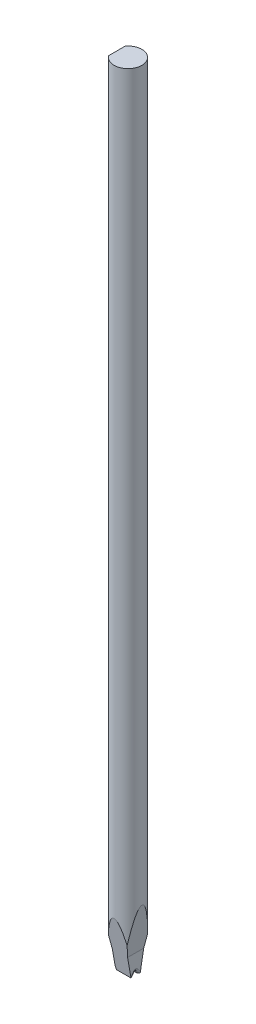
ISO-10303-21;
HEADER;
FILE_DESCRIPTION(('STEP AP214'),'2;1');
FILE_NAME('part.step','',(''),(''),'','','');
FILE_SCHEMA(('AUTOMOTIVE_DESIGN { 1 0 10303 214 1 1 1 1 }'));
ENDSEC;
DATA;
#1=APPLICATION_CONTEXT('core data for automotive mechanical design processes');
#2=APPLICATION_PROTOCOL_DEFINITION('international standard','automotive_design',2000,#1);
#3=PRODUCT_CONTEXT('',#1,'mechanical');
#4=PRODUCT('Part','Part','',(#3));
#5=PRODUCT_RELATED_PRODUCT_CATEGORY('part','',(#4));
#6=PRODUCT_DEFINITION_FORMATION('','',#4);
#7=PRODUCT_DEFINITION_CONTEXT('part definition',#1,'design');
#8=PRODUCT_DEFINITION('design','',#6,#7);
#9=PRODUCT_DEFINITION_SHAPE('','',#8);
#10=(LENGTH_UNIT() NAMED_UNIT(*) SI_UNIT(.MILLI.,.METRE.));
#11=(NAMED_UNIT(*) PLANE_ANGLE_UNIT() SI_UNIT($,.RADIAN.));
#12=(NAMED_UNIT(*) SI_UNIT($,.STERADIAN.) SOLID_ANGLE_UNIT());
#13=UNCERTAINTY_MEASURE_WITH_UNIT(LENGTH_MEASURE(1.E-05),#10,'distance_accuracy_value','');
#14=(GEOMETRIC_REPRESENTATION_CONTEXT(3) GLOBAL_UNCERTAINTY_ASSIGNED_CONTEXT((#13)) GLOBAL_UNIT_ASSIGNED_CONTEXT((#10,
#11,#12)) REPRESENTATION_CONTEXT('',''));
#15=CARTESIAN_POINT('',(0.,0.,0.));
#16=DIRECTION('',(0.,0.,1.));
#17=DIRECTION('',(1.,0.,0.));
#18=AXIS2_PLACEMENT_3D('',#15,#16,#17);
#19=CARTESIAN_POINT('',(0.,0.,0.));
#20=DIRECTION('',(0.,1.,0.));
#21=DIRECTION('',(0.,0.,1.));
#22=AXIS2_PLACEMENT_3D('',#19,#20,#21);
#23=PLANE('',#22);
#24=DIRECTION('',(-1.,0.,0.));
#25=VECTOR('',#24,1.);
#26=CARTESIAN_POINT('',(1.50859998,0.,-0.50038));
#27=LINE('',#26,#25);
#28=CARTESIAN_POINT('',(0.816955552535841,0.,-0.50038));
#29=VERTEX_POINT('',#28);
#30=CARTESIAN_POINT('',(-0.712997622489194,0.,-0.50038));
#31=VERTEX_POINT('',#30);
#32=EDGE_CURVE('E179',#29,#31,#27,.T.);
#33=ORIENTED_EDGE('',*,*,#32,.F.);
#34=CARTESIAN_POINT('',(0.57658,0.,-0.579313817389901));
#35=DIRECTION('',(0.,1.,0.));
#36=DIRECTION('',(0.,0.,-1.));
#37=AXIS2_PLACEMENT_3D('',#34,#35,#36);
#38=ELLIPSE('',#37,0.303875210634501,0.24892);
#39=CARTESIAN_POINT('',(0.57658,0.,-0.2754386067554));
#40=VERTEX_POINT('',#39);
#41=EDGE_CURVE('E276',#29,#40,#38,.F.);
#42=ORIENTED_EDGE('',*,*,#41,.T.);
#43=CARTESIAN_POINT('',(0.57658,0.,-0.2754386067554));
#44=DIRECTION('',(-1.,0.,0.));
#45=VECTOR('',#44,1.);
#46=LINE('',#43,#45);
#47=CARTESIAN_POINT('',(-0.32512,0.,-0.2754386067554));
#48=VERTEX_POINT('',#47);
#49=EDGE_CURVE('E320',#40,#48,#46,.T.);
#50=ORIENTED_EDGE('',*,*,#49,.T.);
#51=CARTESIAN_POINT('',(-0.32512,0.,-0.886289795479857));
#52=DIRECTION('',(0.,1.,0.));
#53=DIRECTION('',(0.,0.,1.));
#54=AXIS2_PLACEMENT_3D('',#51,#52,#53);
#55=ELLIPSE('',#54,0.610851188724456,0.50038);
#56=EDGE_CURVE('E279',#48,#31,#55,.F.);
#57=ORIENTED_EDGE('',*,*,#56,.T.);
#58=EDGE_LOOP('',(#33,#42,#50,#57));
#59=FACE_BOUND('',#58,.T.);
#60=ADVANCED_FACE('F41',(#59),#23,.F.);
#61=CARTESIAN_POINT('',(0.,85.4964,0.));
#62=DIRECTION('',(0.,-1.,0.));
#63=DIRECTION('',(0.,0.,-1.));
#64=AXIS2_PLACEMENT_3D('',#61,#62,#63);
#65=CYLINDRICAL_SURFACE('',#64,1.4986);
#66=CARTESIAN_POINT('',(0.,-3.76553770582815,0.));
#67=DIRECTION('',(-0.99026806874157,-0.139173100960066,0.));
#68=DIRECTION('',(0.139173100960066,-0.99026806874157,0.));
#69=AXIS2_PLACEMENT_3D('',#66,#67,#68);
#70=ELLIPSE('',#69,10.7678853863435,1.4986);
#71=CARTESIAN_POINT('',(-1.01162442143976,3.43254407290874,1.10563013252474));
#72=VERTEX_POINT('',#71);
#73=CARTESIAN_POINT('',(-1.20142,4.7830097860387,0.895763330126881));
#74=VERTEX_POINT('',#73);
#75=EDGE_CURVE('E198',#72,#74,#70,.T.);
#76=ORIENTED_EDGE('',*,*,#75,.F.);
#77=CARTESIAN_POINT('',(0.,-2.83779599690029,0.));
#78=DIRECTION('',(0.,-0.173648177666931,0.984807753012208));
#79=DIRECTION('',(0.,-0.984807753012208,-0.173648177666931));
#80=AXIS2_PLACEMENT_3D('',#77,#78,#79);
#81=ELLIPSE('',#80,8.630093446039,1.4986);
#82=CARTESIAN_POINT('',(1.01162442143975,3.43254407290877,1.10563013252474));
#83=VERTEX_POINT('',#82);
#84=EDGE_CURVE('E165',#83,#72,#81,.T.);
#85=ORIENTED_EDGE('',*,*,#84,.F.);
#86=CARTESIAN_POINT('',(0.,-3.76553770582848,0.));
#87=DIRECTION('',(0.990268068741571,-0.139173100960058,0.));
#88=DIRECTION('',(-0.139173100960058,-0.990268068741571,0.));
#89=AXIS2_PLACEMENT_3D('',#86,#87,#88);
#90=ELLIPSE('',#89,10.7678853863441,1.4986);
#91=CARTESIAN_POINT('',(1.01162442143975,3.43254407290877,-1.10563013252474));
#92=VERTEX_POINT('',#91);
#93=EDGE_CURVE('E215',#92,#83,#90,.T.);
#94=ORIENTED_EDGE('',*,*,#93,.F.);
#95=CARTESIAN_POINT('',(0.,-2.83779599690029,0.));
#96=DIRECTION('',(0.,-0.173648177666931,-0.984807753012208));
#97=DIRECTION('',(0.,-0.984807753012208,0.173648177666931));
#98=AXIS2_PLACEMENT_3D('',#95,#96,#97);
#99=ELLIPSE('',#98,8.630093446039,1.4986);
#100=CARTESIAN_POINT('',(-1.01162442143976,3.43254407290874,-1.10563013252474));
#101=VERTEX_POINT('',#100);
#102=EDGE_CURVE('E200',#101,#92,#99,.T.);
#103=ORIENTED_EDGE('',*,*,#102,.F.);
#104=CARTESIAN_POINT('',(-1.20142,4.78300978603867,-0.89576333012688));
#105=VERTEX_POINT('',#104);
#106=EDGE_CURVE('E178',#105,#101,#70,.T.);
#107=ORIENTED_EDGE('',*,*,#106,.F.);
#108=DIRECTION('',(0.,-1.,0.));
#109=VECTOR('',#108,1.);
#110=CARTESIAN_POINT('',(-1.20142,85.4964,-0.895763330126881));
#111=LINE('',#110,#109);
#112=CARTESIAN_POINT('',(-1.20142,85.4964,-0.89576333012688));
#113=VERTEX_POINT('',#112);
#114=EDGE_CURVE('E206',#113,#105,#111,.T.);
#115=ORIENTED_EDGE('',*,*,#114,.F.);
#116=CARTESIAN_POINT('',(0.,85.4964,0.));
#117=DIRECTION('',(0.,1.,0.));
#118=DIRECTION('',(0.,0.,1.));
#119=AXIS2_PLACEMENT_3D('',#116,#117,#118);
#120=CIRCLE('',#119,1.4986);
#121=CARTESIAN_POINT('',(-1.20142,85.4964,0.89576333012688));
#122=VERTEX_POINT('',#121);
#123=EDGE_CURVE('E209',#122,#113,#120,.T.);
#124=ORIENTED_EDGE('',*,*,#123,.F.);
#125=DIRECTION('',(0.,-1.,0.));
#126=VECTOR('',#125,1.);
#127=CARTESIAN_POINT('',(-1.20142,85.4964,0.895763330126881));
#128=LINE('',#127,#126);
#129=EDGE_CURVE('E204',#74,#122,#128,.F.);
#130=ORIENTED_EDGE('',*,*,#129,.F.);
#131=EDGE_LOOP('',(#76,#85,#94,#103,#107,#115,#124,#130));
#132=FACE_BOUND('',#131,.T.);
#133=ADVANCED_FACE('F239',(#132),#65,.T.);
#134=CARTESIAN_POINT('',(-1.20142,85.4964,1.50859998));
#135=DIRECTION('',(-1.,0.,0.));
#136=DIRECTION('',(0.,0.,1.));
#137=AXIS2_PLACEMENT_3D('',#134,#135,#136);
#138=PLANE('',#137);
#139=ORIENTED_EDGE('',*,*,#114,.T.);
#140=DIRECTION('',(0.,0.,1.));
#141=VECTOR('',#140,1.);
#142=CARTESIAN_POINT('',(-1.20142,4.78300978603867,1.50859998));
#143=LINE('',#142,#141);
#144=EDGE_CURVE('E212',#105,#74,#143,.T.);
#145=ORIENTED_EDGE('',*,*,#144,.T.);
#146=ORIENTED_EDGE('',*,*,#129,.T.);
#147=DIRECTION('',(0.,0.,-1.));
#148=VECTOR('',#147,1.);
#149=CARTESIAN_POINT('',(-1.20142,85.4964,1.50859998));
#150=LINE('',#149,#148);
#151=EDGE_CURVE('E202',#122,#113,#150,.T.);
#152=ORIENTED_EDGE('',*,*,#151,.T.);
#153=EDGE_LOOP('',(#139,#145,#146,#152));
#154=FACE_BOUND('',#153,.T.);
#155=ADVANCED_FACE('F243',(#154),#138,.T.);
#156=CARTESIAN_POINT('',(0.,85.4964,0.));
#157=DIRECTION('',(0.,1.,0.));
#158=DIRECTION('',(0.,0.,1.));
#159=AXIS2_PLACEMENT_3D('',#156,#157,#158);
#160=PLANE('',#159);
#161=ORIENTED_EDGE('',*,*,#123,.T.);
#162=ORIENTED_EDGE('',*,*,#151,.F.);
#163=EDGE_LOOP('',(#161,#162));
#164=FACE_BOUND('',#163,.T.);
#165=ADVANCED_FACE('F237',(#164),#160,.T.);
#166=CARTESIAN_POINT('',(0.8255,2.1082,1.50859998));
#167=DIRECTION('',(0.990268068741571,-0.139173100960058,0.));
#168=DIRECTION('',(0.139173100960058,0.990268068741571,0.));
#169=AXIS2_PLACEMENT_3D('',#166,#167,#168);
#170=PLANE('',#169);
#171=ORIENTED_EDGE('',*,*,#93,.T.);
#172=DIRECTION('',(0.137098791054058,0.975508586841574,0.172008483772957));
#173=VECTOR('',#172,1.);
#174=CARTESIAN_POINT('',(0.547620469171171,0.13098439987012,0.523476083749009));
#175=LINE('',#174,#173);
#176=CARTESIAN_POINT('',(0.8255,2.1082,0.872112540729588));
#177=VERTEX_POINT('',#176);
#178=EDGE_CURVE('E418',#177,#83,#175,.T.);
#179=ORIENTED_EDGE('',*,*,#178,.F.);
#180=DIRECTION('',(0.,0.,-1.));
#181=VECTOR('',#180,1.);
#182=CARTESIAN_POINT('',(0.8255,2.1082,1.50859998));
#183=LINE('',#182,#181);
#184=CARTESIAN_POINT('',(0.8255,2.1082,-0.872112540729588));
#185=VERTEX_POINT('',#184);
#186=EDGE_CURVE('E335',#177,#185,#183,.T.);
#187=ORIENTED_EDGE('',*,*,#186,.T.);
#188=DIRECTION('',(-0.137098791054058,-0.975508586841574,0.172008483772957));
#189=VECTOR('',#188,1.);
#190=CARTESIAN_POINT('',(0.547620469171171,0.13098439987012,-0.523476083749009));
#191=LINE('',#190,#189);
#192=EDGE_CURVE('E417',#92,#185,#191,.T.);
#193=ORIENTED_EDGE('',*,*,#192,.F.);
#194=EDGE_LOOP('',(#171,#179,#187,#193));
#195=FACE_BOUND('',#194,.T.);
#196=ADVANCED_FACE('F351',(#195),#170,.T.);
#197=CARTESIAN_POINT('',(1.50859998,0.,-0.50038));
#198=DIRECTION('',(0.,-0.173648177666931,-0.984807753012208));
#199=DIRECTION('',(0.,0.984807753012208,-0.173648177666931));
#200=AXIS2_PLACEMENT_3D('',#197,#198,#199);
#201=PLANE('',#200);
#202=DIRECTION('',(0.,-0.984807753012208,0.173648177666931));
#203=VECTOR('',#202,1.);
#204=CARTESIAN_POINT('',(0.8255,0.,-0.50038));
#205=LINE('',#204,#203);
#206=CARTESIAN_POINT('',(0.8255,0.0900521493292955,-0.516258623597543));
#207=VERTEX_POINT('',#206);
#208=EDGE_CURVE('E184',#185,#207,#205,.T.);
#209=ORIENTED_EDGE('',*,*,#208,.T.);
#210=CARTESIAN_POINT('',(0.57658,0.0900521493292954,-0.516258623597543));
#211=DIRECTION('',(0.,-0.173648177666931,-0.984807753012208));
#212=DIRECTION('',(0.,-0.984807753012208,0.173648177666931));
#213=AXIS2_PLACEMENT_3D('',#210,#211,#212);
#214=ELLIPSE('',#213,0.352026039945911,0.24892);
#215=EDGE_CURVE('E285',#207,#29,#214,.T.);
#216=ORIENTED_EDGE('',*,*,#215,.T.);
#217=ORIENTED_EDGE('',*,*,#32,.T.);
#218=CARTESIAN_POINT('',(-0.32512,0.44026765307104,-0.578011065969619));
#219=DIRECTION('',(0.,-0.173648177666931,-0.984807753012208));
#220=DIRECTION('',(0.,0.984807753012208,-0.173648177666931));
#221=AXIS2_PLACEMENT_3D('',#218,#219,#220);
#222=ELLIPSE('',#221,0.70764418234025,0.50038);
#223=CARTESIAN_POINT('',(-0.8255,0.44026765307104,-0.578011065969619));
#224=VERTEX_POINT('',#223);
#225=EDGE_CURVE('E316',#31,#224,#222,.T.);
#226=ORIENTED_EDGE('',*,*,#225,.T.);
#227=DIRECTION('',(0.,0.984807753012208,-0.173648177666931));
#228=VECTOR('',#227,1.);
#229=CARTESIAN_POINT('',(-0.8255,0.,-0.50038));
#230=LINE('',#229,#228);
#231=CARTESIAN_POINT('',(-0.8255,2.1082,-0.872112540729588));
#232=VERTEX_POINT('',#231);
#233=EDGE_CURVE('E192',#224,#232,#230,.T.);
#234=ORIENTED_EDGE('',*,*,#233,.T.);
#235=DIRECTION('',(-0.137098791054065,0.975508586841573,-0.172008483772957));
#236=VECTOR('',#235,1.);
#237=CARTESIAN_POINT('',(-0.490908941847195,-0.272539084560951,-0.452324006094318));
#238=LINE('',#237,#236);
#239=EDGE_CURVE('E169',#232,#101,#238,.T.);
#240=ORIENTED_EDGE('',*,*,#239,.T.);
#241=ORIENTED_EDGE('',*,*,#102,.T.);
#242=ORIENTED_EDGE('',*,*,#192,.T.);
#243=EDGE_LOOP('',(#209,#216,#217,#226,#234,#240,#241,#242));
#244=FACE_BOUND('',#243,.T.);
#245=ADVANCED_FACE('F354',(#244),#201,.T.);
#246=CARTESIAN_POINT('',(1.50859998,0.,0.50038));
#247=DIRECTION('',(0.,-0.173648177666931,0.984807753012208));
#248=DIRECTION('',(0.,-0.984807753012208,-0.173648177666931));
#249=AXIS2_PLACEMENT_3D('',#246,#247,#248);
#250=PLANE('',#249);
#251=DIRECTION('',(-1.,0.,0.));
#252=VECTOR('',#251,1.);
#253=CARTESIAN_POINT('',(1.50859998,0.,0.50038));
#254=LINE('',#253,#252);
#255=CARTESIAN_POINT('',(0.816955552535841,0.,0.50038));
#256=VERTEX_POINT('',#255);
#257=CARTESIAN_POINT('',(-0.712997622489194,0.,0.50038));
#258=VERTEX_POINT('',#257);
#259=EDGE_CURVE('E194',#256,#258,#254,.T.);
#260=ORIENTED_EDGE('',*,*,#259,.F.);
#261=CARTESIAN_POINT('',(0.57658,0.0900521493292954,0.516258623597542));
#262=DIRECTION('',(0.,-0.173648177666931,0.984807753012208));
#263=DIRECTION('',(0.,0.984807753012208,0.173648177666931));
#264=AXIS2_PLACEMENT_3D('',#261,#262,#263);
#265=ELLIPSE('',#264,0.352026039945911,0.24892);
#266=CARTESIAN_POINT('',(0.8255,0.0900521493292954,0.516258623597542));
#267=VERTEX_POINT('',#266);
#268=EDGE_CURVE('E50',#256,#267,#265,.T.);
#269=ORIENTED_EDGE('',*,*,#268,.T.);
#270=DIRECTION('',(0.,0.984807753012208,0.173648177666931));
#271=VECTOR('',#270,1.);
#272=CARTESIAN_POINT('',(0.8255,0.,0.50038));
#273=LINE('',#272,#271);
#274=EDGE_CURVE('E187',#267,#177,#273,.T.);
#275=ORIENTED_EDGE('',*,*,#274,.T.);
#276=ORIENTED_EDGE('',*,*,#178,.T.);
#277=ORIENTED_EDGE('',*,*,#84,.T.);
#278=DIRECTION('',(0.137098791054065,-0.975508586841573,-0.172008483772957));
#279=VECTOR('',#278,1.);
#280=CARTESIAN_POINT('',(-0.490908941847195,-0.272539084560951,0.452324006094318));
#281=LINE('',#280,#279);
#282=CARTESIAN_POINT('',(-0.8255,2.1082,0.872112540729588));
#283=VERTEX_POINT('',#282);
#284=EDGE_CURVE('E157',#72,#283,#281,.T.);
#285=ORIENTED_EDGE('',*,*,#284,.T.);
#286=DIRECTION('',(0.,-0.984807753012208,-0.173648177666931));
#287=VECTOR('',#286,1.);
#288=CARTESIAN_POINT('',(-0.8255,0.,0.50038));
#289=LINE('',#288,#287);
#290=CARTESIAN_POINT('',(-0.8255,0.44026765307104,0.578011065969619));
#291=VERTEX_POINT('',#290);
#292=EDGE_CURVE('E161',#283,#291,#289,.T.);
#293=ORIENTED_EDGE('',*,*,#292,.T.);
#294=CARTESIAN_POINT('',(-0.32512,0.44026765307104,0.578011065969619));
#295=DIRECTION('',(0.,-0.173648177666931,0.984807753012208));
#296=DIRECTION('',(0.,-0.984807753012208,-0.173648177666931));
#297=AXIS2_PLACEMENT_3D('',#294,#295,#296);
#298=ELLIPSE('',#297,0.70764418234025,0.50038);
#299=EDGE_CURVE('E395',#291,#258,#298,.T.);
#300=ORIENTED_EDGE('',*,*,#299,.T.);
#301=EDGE_LOOP('',(#260,#269,#275,#276,#277,#285,#293,#300));
#302=FACE_BOUND('',#301,.T.);
#303=ADVANCED_FACE('F159',(#302),#250,.T.);
#304=CARTESIAN_POINT('',(-0.8255,2.1082,1.50859998));
#305=DIRECTION('',(-0.99026806874157,-0.139173100960066,0.));
#306=DIRECTION('',(0.139173100960066,-0.99026806874157,0.));
#307=AXIS2_PLACEMENT_3D('',#304,#305,#306);
#308=PLANE('',#307);
#309=ORIENTED_EDGE('',*,*,#75,.T.);
#310=ORIENTED_EDGE('',*,*,#144,.F.);
#311=ORIENTED_EDGE('',*,*,#106,.T.);
#312=ORIENTED_EDGE('',*,*,#239,.F.);
#313=DIRECTION('',(0.,0.,-1.));
#314=VECTOR('',#313,1.);
#315=CARTESIAN_POINT('',(-0.8255,2.1082,1.50859998));
#316=LINE('',#315,#314);
#317=EDGE_CURVE('E170',#283,#232,#316,.T.);
#318=ORIENTED_EDGE('',*,*,#317,.F.);
#319=ORIENTED_EDGE('',*,*,#284,.F.);
#320=EDGE_LOOP('',(#309,#310,#311,#312,#318,#319));
#321=FACE_BOUND('',#320,.T.);
#322=ADVANCED_FACE('F182',(#321),#308,.T.);
#323=CARTESIAN_POINT('',(-0.8255,2.09820002,1.50859998));
#324=DIRECTION('',(-1.,0.,0.));
#325=DIRECTION('',(0.,-1.,0.));
#326=AXIS2_PLACEMENT_3D('',#323,#324,#325);
#327=PLANE('',#326);
#328=CARTESIAN_POINT('',(-0.8255,0.3048,0.));
#329=DIRECTION('',(-1.,0.,0.));
#330=DIRECTION('',(0.,-1.,0.));
#331=AXIS2_PLACEMENT_3D('',#328,#329,#330);
#332=CIRCLE('',#331,0.55118);
#333=CARTESIAN_POINT('',(-0.8255,0.620943860187968,-0.451500223771207));
#334=VERTEX_POINT('',#333);
#335=CARTESIAN_POINT('',(-0.8255,0.620943860187968,0.451500223771207));
#336=VERTEX_POINT('',#335);
#337=EDGE_CURVE('E385',#334,#336,#332,.F.);
#338=ORIENTED_EDGE('',*,*,#337,.T.);
#339=DIRECTION('',(0.,0.819152044288993,-0.573576436351044));
#340=VECTOR('',#339,1.);
#341=CARTESIAN_POINT('',(-0.8255,0.287006177221335,0.685325906676727));
#342=LINE('',#341,#340);
#343=EDGE_CURVE('E177',#336,#291,#342,.F.);
#344=ORIENTED_EDGE('',*,*,#343,.T.);
#345=ORIENTED_EDGE('',*,*,#292,.F.);
#346=ORIENTED_EDGE('',*,*,#317,.T.);
#347=ORIENTED_EDGE('',*,*,#233,.F.);
#348=DIRECTION('',(0.,-0.819152044288993,-0.573576436351044));
#349=VECTOR('',#348,1.);
#350=CARTESIAN_POINT('',(-0.8255,0.620943860187968,-0.451500223771207));
#351=LINE('',#350,#349);
#352=EDGE_CURVE('E381',#224,#334,#351,.F.);
#353=ORIENTED_EDGE('',*,*,#352,.T.);
#354=EDGE_LOOP('',(#338,#344,#345,#346,#347,#353));
#355=FACE_BOUND('',#354,.T.);
#356=ADVANCED_FACE('F174',(#355),#327,.T.);
#357=CARTESIAN_POINT('',(0.8255,-0.00999998,1.50859998));
#358=DIRECTION('',(1.,0.,0.));
#359=DIRECTION('',(0.,0.,-1.));
#360=AXIS2_PLACEMENT_3D('',#357,#358,#359);
#361=PLANE('',#360);
#362=CARTESIAN_POINT('',(0.8255,0.3048,0.));
#363=DIRECTION('',(1.,0.,0.));
#364=DIRECTION('',(0.,0.,-1.));
#365=AXIS2_PLACEMENT_3D('',#362,#363,#364);
#366=CIRCLE('',#365,0.29972);
#367=CARTESIAN_POINT('',(0.8255,0.476712329503135,0.245516250714297));
#368=VERTEX_POINT('',#367);
#369=CARTESIAN_POINT('',(0.8255,0.476712329503135,-0.245516250714297));
#370=VERTEX_POINT('',#369);
#371=EDGE_CURVE('E408',#368,#370,#366,.F.);
#372=ORIENTED_EDGE('',*,*,#371,.T.);
#373=DIRECTION('',(0.,0.819152044288993,0.573576436351044));
#374=VECTOR('',#373,1.);
#375=CARTESIAN_POINT('',(0.8255,0.142774646536502,-0.479341933619817));
#376=LINE('',#375,#374);
#377=EDGE_CURVE('E291',#370,#207,#376,.F.);
#378=ORIENTED_EDGE('',*,*,#377,.T.);
#379=ORIENTED_EDGE('',*,*,#208,.F.);
#380=ORIENTED_EDGE('',*,*,#186,.F.);
#381=ORIENTED_EDGE('',*,*,#274,.F.);
#382=DIRECTION('',(0.,-0.819152044288993,0.573576436351044));
#383=VECTOR('',#382,1.);
#384=CARTESIAN_POINT('',(0.8255,0.476712329503135,0.245516250714297));
#385=LINE('',#384,#383);
#386=EDGE_CURVE('E410',#267,#368,#385,.F.);
#387=ORIENTED_EDGE('',*,*,#386,.T.);
#388=EDGE_LOOP('',(#372,#378,#379,#380,#381,#387));
#389=FACE_BOUND('',#388,.T.);
#390=ADVANCED_FACE('F236',(#389),#361,.T.);
#391=CARTESIAN_POINT('',(-0.32512,0.,0.2754386067554));
#392=DIRECTION('',(1.,0.,0.));
#393=VECTOR('',#392,1.);
#394=LINE('',#391,#393);
#395=CARTESIAN_POINT('',(-0.32512,0.,0.2754386067554));
#396=VERTEX_POINT('',#395);
#397=CARTESIAN_POINT('',(0.57658,0.,0.2754386067554));
#398=VERTEX_POINT('',#397);
#399=EDGE_CURVE('E217',#396,#398,#394,.T.);
#400=ORIENTED_EDGE('',*,*,#399,.T.);
#401=CARTESIAN_POINT('',(0.57658,0.,0.579313817389901));
#402=DIRECTION('',(0.,1.,0.));
#403=DIRECTION('',(0.,0.,-1.));
#404=AXIS2_PLACEMENT_3D('',#401,#402,#403);
#405=ELLIPSE('',#404,0.303875210634501,0.24892);
#406=EDGE_CURVE('E58',#398,#256,#405,.F.);
#407=ORIENTED_EDGE('',*,*,#406,.T.);
#408=ORIENTED_EDGE('',*,*,#259,.T.);
#409=CARTESIAN_POINT('',(-0.32512,0.,0.886289795479856));
#410=DIRECTION('',(0.,1.,0.));
#411=DIRECTION('',(0.,0.,1.));
#412=AXIS2_PLACEMENT_3D('',#409,#410,#411);
#413=ELLIPSE('',#412,0.610851188724456,0.50038);
#414=EDGE_CURVE('E397',#258,#396,#413,.F.);
#415=ORIENTED_EDGE('',*,*,#414,.T.);
#416=EDGE_LOOP('',(#400,#407,#408,#415));
#417=FACE_BOUND('',#416,.T.);
#418=ADVANCED_FACE('F225',(#417),#23,.F.);
#419=CARTESIAN_POINT('',(-1.20142,0.333937682966633,-0.0416129238498808));
#420=DIRECTION('',(0.,0.573576436351044,-0.819152044288993));
#421=DIRECTION('',(0.,0.819152044288993,0.573576436351044));
#422=AXIS2_PLACEMENT_3D('',#419,#420,#421);
#423=PLANE('',#422);
#424=ORIENTED_EDGE('',*,*,#49,.F.);
#425=DIRECTION('',(0.,0.819152044288993,0.573576436351044));
#426=VECTOR('',#425,1.);
#427=CARTESIAN_POINT('',(0.57658,0.333937682966633,-0.0416129238498808));
#428=LINE('',#427,#426);
#429=CARTESIAN_POINT('',(0.57658,0.333937682966633,-0.0416129238498808));
#430=VERTEX_POINT('',#429);
#431=EDGE_CURVE('E287',#40,#430,#428,.T.);
#432=ORIENTED_EDGE('',*,*,#431,.T.);
#433=DIRECTION('',(1.,0.,0.));
#434=VECTOR('',#433,1.);
#435=CARTESIAN_POINT('',(-1.20142,0.333937682966633,-0.0416129238498808));
#436=LINE('',#435,#434);
#437=CARTESIAN_POINT('',(-0.32512,0.333937682966633,-0.0416129238498808));
#438=VERTEX_POINT('',#437);
#439=EDGE_CURVE('E313',#438,#430,#436,.T.);
#440=ORIENTED_EDGE('',*,*,#439,.F.);
#441=DIRECTION('',(0.,-0.819152044288993,-0.573576436351044));
#442=VECTOR('',#441,1.);
#443=CARTESIAN_POINT('',(-0.32512,0.,-0.2754386067554));
#444=LINE('',#443,#442);
#445=EDGE_CURVE('E403',#438,#48,#444,.T.);
#446=ORIENTED_EDGE('',*,*,#445,.T.);
#447=EDGE_LOOP('',(#424,#432,#440,#446));
#448=FACE_BOUND('',#447,.T.);
#449=ADVANCED_FACE('F235',(#448),#423,.F.);
#450=CARTESIAN_POINT('',(-1.20142,-0.00999998000000014,0.282440668133347));
#451=DIRECTION('',(0.,0.573576436351044,0.819152044288993));
#452=DIRECTION('',(0.,-0.819152044288993,0.573576436351044));
#453=AXIS2_PLACEMENT_3D('',#450,#451,#452);
#454=PLANE('',#453);
#455=DIRECTION('',(1.,0.,0.));
#456=VECTOR('',#455,1.);
#457=CARTESIAN_POINT('',(-1.20142,0.333937682966633,0.0416129238498808));
#458=LINE('',#457,#456);
#459=CARTESIAN_POINT('',(-0.32512,0.333937682966633,0.0416129238498808));
#460=VERTEX_POINT('',#459);
#461=CARTESIAN_POINT('',(0.57658,0.333937682966633,0.0416129238498808));
#462=VERTEX_POINT('',#461);
#463=EDGE_CURVE('E421',#460,#462,#458,.T.);
#464=ORIENTED_EDGE('',*,*,#463,.T.);
#465=DIRECTION('',(0.,-0.819152044288993,0.573576436351044));
#466=VECTOR('',#465,1.);
#467=CARTESIAN_POINT('',(0.57658,0.,0.2754386067554));
#468=LINE('',#467,#466);
#469=EDGE_CURVE('E288',#462,#398,#468,.T.);
#470=ORIENTED_EDGE('',*,*,#469,.T.);
#471=ORIENTED_EDGE('',*,*,#399,.F.);
#472=DIRECTION('',(0.,0.819152044288993,-0.573576436351044));
#473=VECTOR('',#472,1.);
#474=CARTESIAN_POINT('',(-0.32512,0.333937682966633,0.0416129238498808));
#475=LINE('',#474,#473);
#476=EDGE_CURVE('E386',#396,#460,#475,.T.);
#477=ORIENTED_EDGE('',*,*,#476,.T.);
#478=EDGE_LOOP('',(#464,#470,#471,#477));
#479=FACE_BOUND('',#478,.T.);
#480=ADVANCED_FACE('F345',(#479),#454,.F.);
#481=CARTESIAN_POINT('',(-1.20142,0.3048,0.));
#482=DIRECTION('',(1.,0.,0.));
#483=DIRECTION('',(0.,0.,-1.));
#484=AXIS2_PLACEMENT_3D('',#481,#482,#483);
#485=CYLINDRICAL_SURFACE('',#484,0.0508);
#486=ORIENTED_EDGE('',*,*,#439,.T.);
#487=CARTESIAN_POINT('',(0.57658,0.3048,0.));
#488=DIRECTION('',(1.,0.,0.));
#489=DIRECTION('',(0.,0.,-1.));
#490=AXIS2_PLACEMENT_3D('',#487,#488,#489);
#491=CIRCLE('',#490,0.0508);
#492=EDGE_CURVE('E11',#430,#462,#491,.T.);
#493=ORIENTED_EDGE('',*,*,#492,.T.);
#494=ORIENTED_EDGE('',*,*,#463,.F.);
#495=CARTESIAN_POINT('',(-0.32512,0.3048,0.));
#496=DIRECTION('',(-1.,0.,0.));
#497=DIRECTION('',(0.,-1.,0.));
#498=AXIS2_PLACEMENT_3D('',#495,#496,#497);
#499=CIRCLE('',#498,0.0508);
#500=EDGE_CURVE('E399',#460,#438,#499,.T.);
#501=ORIENTED_EDGE('',*,*,#500,.T.);
#502=EDGE_LOOP('',(#486,#493,#494,#501));
#503=FACE_BOUND('',#502,.T.);
#504=ADVANCED_FACE('F256',(#503),#485,.F.);
#505=CARTESIAN_POINT('',(-0.32512,0.620943860187968,-0.451500223771207));
#506=DIRECTION('',(0.,0.819152044288993,0.573576436351044));
#507=DIRECTION('',(0.,-0.573576436351044,0.819152044288993));
#508=AXIS2_PLACEMENT_3D('',#505,#506,#507);
#509=CYLINDRICAL_SURFACE('',#508,0.50038);
#510=ORIENTED_EDGE('',*,*,#56,.F.);
#511=ORIENTED_EDGE('',*,*,#445,.F.);
#512=CARTESIAN_POINT('',(-0.32512,0.620943860187968,-0.451500223771207));
#513=DIRECTION('',(0.,0.819152044288993,0.573576436351044));
#514=DIRECTION('',(0.,-0.573576436351044,0.819152044288994));
#515=AXIS2_PLACEMENT_3D('',#512,#513,#514);
#516=CIRCLE('',#515,0.50038);
#517=EDGE_CURVE('E307',#334,#438,#516,.T.);
#518=ORIENTED_EDGE('',*,*,#517,.F.);
#519=ORIENTED_EDGE('',*,*,#352,.F.);
#520=ORIENTED_EDGE('',*,*,#225,.F.);
#521=EDGE_LOOP('',(#510,#511,#518,#519,#520));
#522=FACE_BOUND('',#521,.T.);
#523=ADVANCED_FACE('F252',(#522),#509,.T.);
#524=CARTESIAN_POINT('',(-0.32512,0.3048,0.));
#525=DIRECTION('',(-1.,0.,0.));
#526=DIRECTION('',(0.,-1.,0.));
#527=AXIS2_PLACEMENT_3D('',#524,#525,#526);
#528=TOROIDAL_SURFACE('',#527,0.55118,0.50038);
#529=ORIENTED_EDGE('',*,*,#517,.T.);
#530=ORIENTED_EDGE('',*,*,#500,.F.);
#531=CARTESIAN_POINT('',(-0.32512,0.620943860187968,0.451500223771207));
#532=DIRECTION('',(0.,-0.819152044288993,0.573576436351044));
#533=DIRECTION('',(0.,-0.573576436351044,-0.819152044288994));
#534=AXIS2_PLACEMENT_3D('',#531,#532,#533);
#535=CIRCLE('',#534,0.50038);
#536=EDGE_CURVE('E304',#336,#460,#535,.T.);
#537=ORIENTED_EDGE('',*,*,#536,.F.);
#538=ORIENTED_EDGE('',*,*,#337,.F.);
#539=EDGE_LOOP('',(#529,#530,#537,#538));
#540=FACE_BOUND('',#539,.T.);
#541=ADVANCED_FACE('F248',(#540),#528,.T.);
#542=CARTESIAN_POINT('',(-0.32512,0.277006197221335,0.692327968054673));
#543=DIRECTION('',(0.,-0.819152044288993,0.573576436351044));
#544=DIRECTION('',(0.,-0.573576436351044,-0.819152044288993));
#545=AXIS2_PLACEMENT_3D('',#542,#543,#544);
#546=CYLINDRICAL_SURFACE('',#545,0.50038);
#547=ORIENTED_EDGE('',*,*,#299,.F.);
#548=ORIENTED_EDGE('',*,*,#343,.F.);
#549=ORIENTED_EDGE('',*,*,#536,.T.);
#550=ORIENTED_EDGE('',*,*,#476,.F.);
#551=ORIENTED_EDGE('',*,*,#414,.F.);
#552=EDGE_LOOP('',(#547,#548,#549,#550,#551));
#553=FACE_BOUND('',#552,.T.);
#554=ADVANCED_FACE('F245',(#553),#546,.T.);
#555=CARTESIAN_POINT('',(0.57658,0.132774666536502,0.486343994997763));
#556=DIRECTION('',(0.,0.819152044288993,-0.573576436351044));
#557=DIRECTION('',(0.,0.573576436351044,0.819152044288993));
#558=AXIS2_PLACEMENT_3D('',#555,#556,#557);
#559=CYLINDRICAL_SURFACE('',#558,0.24892);
#560=ORIENTED_EDGE('',*,*,#406,.F.);
#561=ORIENTED_EDGE('',*,*,#469,.F.);
#562=CARTESIAN_POINT('',(0.57658,0.476712329503135,0.245516250714297));
#563=DIRECTION('',(0.,0.819152044288993,-0.573576436351044));
#564=DIRECTION('',(0.,0.573576436351044,0.819152044288993));
#565=AXIS2_PLACEMENT_3D('',#562,#563,#564);
#566=CIRCLE('',#565,0.24892);
#567=EDGE_CURVE('E45',#368,#462,#566,.T.);
#568=ORIENTED_EDGE('',*,*,#567,.F.);
#569=ORIENTED_EDGE('',*,*,#386,.F.);
#570=ORIENTED_EDGE('',*,*,#268,.F.);
#571=EDGE_LOOP('',(#560,#561,#568,#569,#570));
#572=FACE_BOUND('',#571,.T.);
#573=ADVANCED_FACE('F43',(#572),#559,.T.);
#574=CARTESIAN_POINT('',(0.57658,0.3048,0.));
#575=DIRECTION('',(1.,0.,0.));
#576=DIRECTION('',(0.,0.,-1.));
#577=AXIS2_PLACEMENT_3D('',#574,#575,#576);
#578=TOROIDAL_SURFACE('',#577,0.29972,0.24892);
#579=ORIENTED_EDGE('',*,*,#567,.T.);
#580=ORIENTED_EDGE('',*,*,#492,.F.);
#581=CARTESIAN_POINT('',(0.57658,0.476712329503135,-0.245516250714297));
#582=DIRECTION('',(0.,-0.819152044288993,-0.573576436351044));
#583=DIRECTION('',(0.,0.573576436351044,-0.819152044288993));
#584=AXIS2_PLACEMENT_3D('',#581,#582,#583);
#585=CIRCLE('',#584,0.24892);
#586=EDGE_CURVE('E302',#370,#430,#585,.T.);
#587=ORIENTED_EDGE('',*,*,#586,.F.);
#588=ORIENTED_EDGE('',*,*,#371,.F.);
#589=EDGE_LOOP('',(#579,#580,#587,#588));
#590=FACE_BOUND('',#589,.T.);
#591=ADVANCED_FACE('F260',(#590),#578,.T.);
#592=CARTESIAN_POINT('',(0.57658,0.476712329503135,-0.245516250714297));
#593=DIRECTION('',(0.,-0.819152044288993,-0.573576436351044));
#594=DIRECTION('',(0.,0.573576436351044,-0.819152044288993));
#595=AXIS2_PLACEMENT_3D('',#592,#593,#594);
#596=CYLINDRICAL_SURFACE('',#595,0.24892);
#597=ORIENTED_EDGE('',*,*,#215,.F.);
#598=ORIENTED_EDGE('',*,*,#377,.F.);
#599=ORIENTED_EDGE('',*,*,#586,.T.);
#600=ORIENTED_EDGE('',*,*,#431,.F.);
#601=ORIENTED_EDGE('',*,*,#41,.F.);
#602=EDGE_LOOP('',(#597,#598,#599,#600,#601));
#603=FACE_BOUND('',#602,.T.);
#604=ADVANCED_FACE('F258',(#603),#596,.T.);
#605=CLOSED_SHELL('',(#60,#133,#155,#165,#196,#245,#303,#322,#356,#390,#418,#449,#480,#504,#523,
#541,#554,#573,#591,#604));
#606=MANIFOLD_SOLID_BREP('B2',#605);
#607=ADVANCED_BREP_SHAPE_REPRESENTATION('',(#18,#606),#14);
#608=SHAPE_DEFINITION_REPRESENTATION(#9,#607);
ENDSEC;
END-ISO-10303-21;
